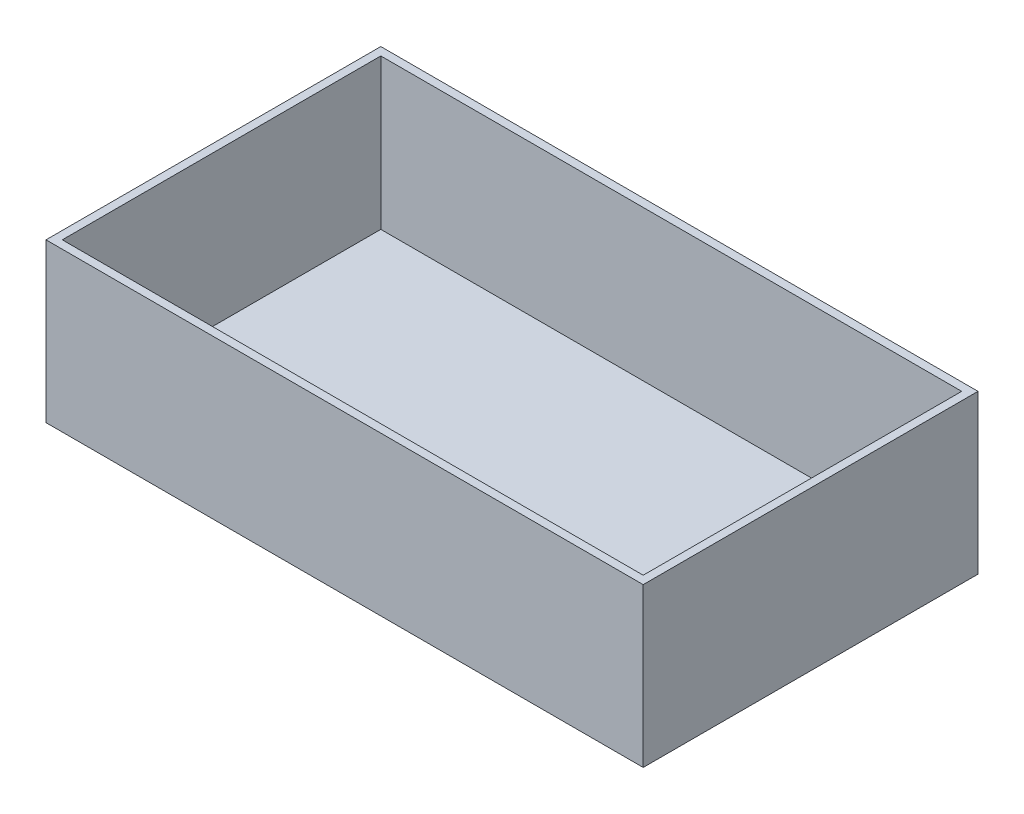
ISO-10303-21;
HEADER;
FILE_DESCRIPTION(('STEP AP214'),'2;1');
FILE_NAME('part.step','',(''),(''),'','','');
FILE_SCHEMA(('AUTOMOTIVE_DESIGN { 1 0 10303 214 1 1 1 1 }'));
ENDSEC;
DATA;
#1=APPLICATION_CONTEXT('core data for automotive mechanical design processes');
#2=APPLICATION_PROTOCOL_DEFINITION('international standard','automotive_design',2000,#1);
#3=PRODUCT_CONTEXT('',#1,'mechanical');
#4=PRODUCT('Part','Part','',(#3));
#5=PRODUCT_RELATED_PRODUCT_CATEGORY('part','',(#4));
#6=PRODUCT_DEFINITION_FORMATION('','',#4);
#7=PRODUCT_DEFINITION_CONTEXT('part definition',#1,'design');
#8=PRODUCT_DEFINITION('design','',#6,#7);
#9=PRODUCT_DEFINITION_SHAPE('','',#8);
#10=(LENGTH_UNIT() NAMED_UNIT(*) SI_UNIT(.MILLI.,.METRE.));
#11=(NAMED_UNIT(*) PLANE_ANGLE_UNIT() SI_UNIT($,.RADIAN.));
#12=(NAMED_UNIT(*) SI_UNIT($,.STERADIAN.) SOLID_ANGLE_UNIT());
#13=UNCERTAINTY_MEASURE_WITH_UNIT(LENGTH_MEASURE(1.E-05),#10,'distance_accuracy_value','');
#14=(GEOMETRIC_REPRESENTATION_CONTEXT(3) GLOBAL_UNCERTAINTY_ASSIGNED_CONTEXT((#13)) GLOBAL_UNIT_ASSIGNED_CONTEXT((#10,
#11,#12)) REPRESENTATION_CONTEXT('',''));
#15=CARTESIAN_POINT('',(0.,0.,0.));
#16=DIRECTION('',(0.,0.,1.));
#17=DIRECTION('',(1.,0.,0.));
#18=AXIS2_PLACEMENT_3D('',#15,#16,#17);
#19=CARTESIAN_POINT('',(660.,350.,370.));
#20=DIRECTION('',(-1.,0.,0.));
#21=DIRECTION('',(0.,0.,1.));
#22=AXIS2_PLACEMENT_3D('',#19,#20,#21);
#23=PLANE('',#22);
#24=DIRECTION('',(0.,0.,-1.));
#25=VECTOR('',#24,1.);
#26=CARTESIAN_POINT('',(660.,0.,370.));
#27=LINE('',#26,#25);
#28=CARTESIAN_POINT('',(660.,0.,370.));
#29=VERTEX_POINT('',#28);
#30=CARTESIAN_POINT('',(660.,0.,-370.));
#31=VERTEX_POINT('',#30);
#32=EDGE_CURVE('E143',#29,#31,#27,.T.);
#33=ORIENTED_EDGE('',*,*,#32,.T.);
#34=DIRECTION('',(0.,-1.,0.));
#35=VECTOR('',#34,1.);
#36=CARTESIAN_POINT('',(660.,350.,-370.));
#37=LINE('',#36,#35);
#38=CARTESIAN_POINT('',(660.,350.,-370.));
#39=VERTEX_POINT('',#38);
#40=EDGE_CURVE('E11',#39,#31,#37,.T.);
#41=ORIENTED_EDGE('',*,*,#40,.F.);
#42=DIRECTION('',(0.,0.,-1.));
#43=VECTOR('',#42,1.);
#44=CARTESIAN_POINT('',(660.,350.,370.));
#45=LINE('',#44,#43);
#46=CARTESIAN_POINT('',(660.,350.,370.));
#47=VERTEX_POINT('',#46);
#48=EDGE_CURVE('E147',#47,#39,#45,.T.);
#49=ORIENTED_EDGE('',*,*,#48,.F.);
#50=DIRECTION('',(0.,-1.,0.));
#51=VECTOR('',#50,1.);
#52=CARTESIAN_POINT('',(660.,350.,370.));
#53=LINE('',#52,#51);
#54=EDGE_CURVE('E153',#47,#29,#53,.T.);
#55=ORIENTED_EDGE('',*,*,#54,.T.);
#56=EDGE_LOOP('',(#33,#41,#49,#55));
#57=FACE_BOUND('',#56,.T.);
#58=ADVANCED_FACE('F35',(#57),#23,.F.);
#59=CARTESIAN_POINT('',(-660.,350.,-370.));
#60=DIRECTION('',(0.,0.,1.));
#61=DIRECTION('',(1.,0.,0.));
#62=AXIS2_PLACEMENT_3D('',#59,#60,#61);
#63=PLANE('',#62);
#64=DIRECTION('',(-1.,0.,0.));
#65=VECTOR('',#64,1.);
#66=CARTESIAN_POINT('',(-660.,0.,-370.));
#67=LINE('',#66,#65);
#68=CARTESIAN_POINT('',(-660.,0.,-370.));
#69=VERTEX_POINT('',#68);
#70=EDGE_CURVE('E156',#31,#69,#67,.T.);
#71=ORIENTED_EDGE('',*,*,#70,.T.);
#72=DIRECTION('',(0.,-1.,0.));
#73=VECTOR('',#72,1.);
#74=CARTESIAN_POINT('',(-660.,350.,-370.));
#75=LINE('',#74,#73);
#76=CARTESIAN_POINT('',(-660.,350.,-370.));
#77=VERTEX_POINT('',#76);
#78=EDGE_CURVE('E42',#77,#69,#75,.T.);
#79=ORIENTED_EDGE('',*,*,#78,.F.);
#80=DIRECTION('',(-1.,0.,0.));
#81=VECTOR('',#80,1.);
#82=CARTESIAN_POINT('',(-660.,350.,-370.));
#83=LINE('',#82,#81);
#84=EDGE_CURVE('E86',#39,#77,#83,.T.);
#85=ORIENTED_EDGE('',*,*,#84,.F.);
#86=ORIENTED_EDGE('',*,*,#40,.T.);
#87=EDGE_LOOP('',(#71,#79,#85,#86));
#88=FACE_BOUND('',#87,.T.);
#89=ADVANCED_FACE('F185',(#88),#63,.F.);
#90=CARTESIAN_POINT('',(-660.,350.,370.));
#91=DIRECTION('',(1.,0.,0.));
#92=DIRECTION('',(0.,0.,-1.));
#93=AXIS2_PLACEMENT_3D('',#90,#91,#92);
#94=PLANE('',#93);
#95=DIRECTION('',(0.,0.,1.));
#96=VECTOR('',#95,1.);
#97=CARTESIAN_POINT('',(-660.,0.,370.));
#98=LINE('',#97,#96);
#99=CARTESIAN_POINT('',(-660.,0.,370.));
#100=VERTEX_POINT('',#99);
#101=EDGE_CURVE('E158',#69,#100,#98,.T.);
#102=ORIENTED_EDGE('',*,*,#101,.T.);
#103=DIRECTION('',(0.,-1.,0.));
#104=VECTOR('',#103,1.);
#105=CARTESIAN_POINT('',(-660.,350.,370.));
#106=LINE('',#105,#104);
#107=CARTESIAN_POINT('',(-660.,350.,370.));
#108=VERTEX_POINT('',#107);
#109=EDGE_CURVE('E162',#108,#100,#106,.T.);
#110=ORIENTED_EDGE('',*,*,#109,.F.);
#111=DIRECTION('',(0.,0.,1.));
#112=VECTOR('',#111,1.);
#113=CARTESIAN_POINT('',(-660.,350.,370.));
#114=LINE('',#113,#112);
#115=EDGE_CURVE('E150',#77,#108,#114,.T.);
#116=ORIENTED_EDGE('',*,*,#115,.F.);
#117=ORIENTED_EDGE('',*,*,#78,.T.);
#118=EDGE_LOOP('',(#102,#110,#116,#117));
#119=FACE_BOUND('',#118,.T.);
#120=ADVANCED_FACE('F167',(#119),#94,.F.);
#121=CARTESIAN_POINT('',(-660.,350.,370.));
#122=DIRECTION('',(0.,0.,-1.));
#123=DIRECTION('',(-1.,0.,0.));
#124=AXIS2_PLACEMENT_3D('',#121,#122,#123);
#125=PLANE('',#124);
#126=DIRECTION('',(1.,0.,0.));
#127=VECTOR('',#126,1.);
#128=CARTESIAN_POINT('',(-660.,0.,370.));
#129=LINE('',#128,#127);
#130=EDGE_CURVE('E79',#100,#29,#129,.T.);
#131=ORIENTED_EDGE('',*,*,#130,.T.);
#132=ORIENTED_EDGE('',*,*,#54,.F.);
#133=DIRECTION('',(1.,0.,0.));
#134=VECTOR('',#133,1.);
#135=CARTESIAN_POINT('',(-660.,350.,370.));
#136=LINE('',#135,#134);
#137=EDGE_CURVE('E58',#108,#47,#136,.T.);
#138=ORIENTED_EDGE('',*,*,#137,.F.);
#139=ORIENTED_EDGE('',*,*,#109,.T.);
#140=EDGE_LOOP('',(#131,#132,#138,#139));
#141=FACE_BOUND('',#140,.T.);
#142=ADVANCED_FACE('F175',(#141),#125,.F.);
#143=CARTESIAN_POINT('',(0.,350.,0.));
#144=DIRECTION('',(0.,-1.,0.));
#145=DIRECTION('',(0.,0.,-1.));
#146=AXIS2_PLACEMENT_3D('',#143,#144,#145);
#147=PLANE('',#146);
#148=DIRECTION('',(-1.,0.,0.));
#149=VECTOR('',#148,1.);
#150=CARTESIAN_POINT('',(-642.,350.,-352.));
#151=LINE('',#150,#149);
#152=CARTESIAN_POINT('',(642.,350.,-352.));
#153=VERTEX_POINT('',#152);
#154=CARTESIAN_POINT('',(-642.,350.,-352.));
#155=VERTEX_POINT('',#154);
#156=EDGE_CURVE('E137',#153,#155,#151,.T.);
#157=ORIENTED_EDGE('',*,*,#156,.F.);
#158=DIRECTION('',(0.,0.,-1.));
#159=VECTOR('',#158,1.);
#160=CARTESIAN_POINT('',(642.,350.,352.));
#161=LINE('',#160,#159);
#162=CARTESIAN_POINT('',(642.,350.,352.));
#163=VERTEX_POINT('',#162);
#164=EDGE_CURVE('E49',#163,#153,#161,.T.);
#165=ORIENTED_EDGE('',*,*,#164,.F.);
#166=DIRECTION('',(1.,0.,0.));
#167=VECTOR('',#166,1.);
#168=CARTESIAN_POINT('',(-642.,350.,352.));
#169=LINE('',#168,#167);
#170=CARTESIAN_POINT('',(-642.,350.,352.));
#171=VERTEX_POINT('',#170);
#172=EDGE_CURVE('E128',#171,#163,#169,.T.);
#173=ORIENTED_EDGE('',*,*,#172,.F.);
#174=DIRECTION('',(0.,0.,1.));
#175=VECTOR('',#174,1.);
#176=CARTESIAN_POINT('',(-642.,350.,352.));
#177=LINE('',#176,#175);
#178=EDGE_CURVE('E131',#155,#171,#177,.T.);
#179=ORIENTED_EDGE('',*,*,#178,.F.);
#180=EDGE_LOOP('',(#157,#165,#173,#179));
#181=FACE_BOUND('',#180,.T.);
#182=ORIENTED_EDGE('',*,*,#48,.T.);
#183=ORIENTED_EDGE('',*,*,#84,.T.);
#184=ORIENTED_EDGE('',*,*,#115,.T.);
#185=ORIENTED_EDGE('',*,*,#137,.T.);
#186=EDGE_LOOP('',(#182,#183,#184,#185));
#187=FACE_BOUND('',#186,.T.);
#188=ADVANCED_FACE('F177',(#181,#187),#147,.F.);
#189=CARTESIAN_POINT('',(0.,0.,0.));
#190=DIRECTION('',(0.,-1.,0.));
#191=DIRECTION('',(0.,0.,-1.));
#192=AXIS2_PLACEMENT_3D('',#189,#190,#191);
#193=PLANE('',#192);
#194=ORIENTED_EDGE('',*,*,#32,.F.);
#195=ORIENTED_EDGE('',*,*,#130,.F.);
#196=ORIENTED_EDGE('',*,*,#101,.F.);
#197=ORIENTED_EDGE('',*,*,#70,.F.);
#198=EDGE_LOOP('',(#194,#195,#196,#197));
#199=FACE_BOUND('',#198,.T.);
#200=ADVANCED_FACE('F171',(#199),#193,.T.);
#201=CARTESIAN_POINT('',(642.,18.,352.));
#202=DIRECTION('',(1.,0.,0.));
#203=DIRECTION('',(0.,0.,-1.));
#204=AXIS2_PLACEMENT_3D('',#201,#202,#203);
#205=PLANE('',#204);
#206=ORIENTED_EDGE('',*,*,#164,.T.);
#207=DIRECTION('',(0.,1.,0.));
#208=VECTOR('',#207,1.);
#209=CARTESIAN_POINT('',(642.,18.,-352.));
#210=LINE('',#209,#208);
#211=CARTESIAN_POINT('',(642.,18.,-352.));
#212=VERTEX_POINT('',#211);
#213=EDGE_CURVE('E106',#212,#153,#210,.T.);
#214=ORIENTED_EDGE('',*,*,#213,.F.);
#215=DIRECTION('',(0.,0.,-1.));
#216=VECTOR('',#215,1.);
#217=CARTESIAN_POINT('',(642.,18.,352.));
#218=LINE('',#217,#216);
#219=CARTESIAN_POINT('',(642.,18.,352.));
#220=VERTEX_POINT('',#219);
#221=EDGE_CURVE('E110',#220,#212,#218,.T.);
#222=ORIENTED_EDGE('',*,*,#221,.F.);
#223=DIRECTION('',(0.,1.,0.));
#224=VECTOR('',#223,1.);
#225=CARTESIAN_POINT('',(642.,18.,352.));
#226=LINE('',#225,#224);
#227=EDGE_CURVE('E141',#220,#163,#226,.T.);
#228=ORIENTED_EDGE('',*,*,#227,.T.);
#229=EDGE_LOOP('',(#206,#214,#222,#228));
#230=FACE_BOUND('',#229,.T.);
#231=ADVANCED_FACE('F108',(#230),#205,.F.);
#232=CARTESIAN_POINT('',(-642.,18.,352.));
#233=DIRECTION('',(0.,0.,1.));
#234=DIRECTION('',(1.,0.,0.));
#235=AXIS2_PLACEMENT_3D('',#232,#233,#234);
#236=PLANE('',#235);
#237=ORIENTED_EDGE('',*,*,#172,.T.);
#238=ORIENTED_EDGE('',*,*,#227,.F.);
#239=DIRECTION('',(1.,0.,0.));
#240=VECTOR('',#239,1.);
#241=CARTESIAN_POINT('',(-642.,18.,352.));
#242=LINE('',#241,#240);
#243=CARTESIAN_POINT('',(-642.,18.,352.));
#244=VERTEX_POINT('',#243);
#245=EDGE_CURVE('E116',#244,#220,#242,.T.);
#246=ORIENTED_EDGE('',*,*,#245,.F.);
#247=DIRECTION('',(0.,1.,0.));
#248=VECTOR('',#247,1.);
#249=CARTESIAN_POINT('',(-642.,18.,352.));
#250=LINE('',#249,#248);
#251=EDGE_CURVE('E144',#244,#171,#250,.T.);
#252=ORIENTED_EDGE('',*,*,#251,.T.);
#253=EDGE_LOOP('',(#237,#238,#246,#252));
#254=FACE_BOUND('',#253,.T.);
#255=ADVANCED_FACE('F224',(#254),#236,.F.);
#256=CARTESIAN_POINT('',(-642.,18.,352.));
#257=DIRECTION('',(-1.,0.,0.));
#258=DIRECTION('',(0.,0.,1.));
#259=AXIS2_PLACEMENT_3D('',#256,#257,#258);
#260=PLANE('',#259);
#261=ORIENTED_EDGE('',*,*,#178,.T.);
#262=ORIENTED_EDGE('',*,*,#251,.F.);
#263=DIRECTION('',(0.,0.,1.));
#264=VECTOR('',#263,1.);
#265=CARTESIAN_POINT('',(-642.,18.,352.));
#266=LINE('',#265,#264);
#267=CARTESIAN_POINT('',(-642.,18.,-352.));
#268=VERTEX_POINT('',#267);
#269=EDGE_CURVE('E124',#268,#244,#266,.T.);
#270=ORIENTED_EDGE('',*,*,#269,.F.);
#271=DIRECTION('',(0.,1.,0.));
#272=VECTOR('',#271,1.);
#273=CARTESIAN_POINT('',(-642.,18.,-352.));
#274=LINE('',#273,#272);
#275=EDGE_CURVE('E115',#268,#155,#274,.T.);
#276=ORIENTED_EDGE('',*,*,#275,.T.);
#277=EDGE_LOOP('',(#261,#262,#270,#276));
#278=FACE_BOUND('',#277,.T.);
#279=ADVANCED_FACE('F233',(#278),#260,.F.);
#280=CARTESIAN_POINT('',(-642.,18.,-352.));
#281=DIRECTION('',(0.,0.,-1.));
#282=DIRECTION('',(-1.,0.,0.));
#283=AXIS2_PLACEMENT_3D('',#280,#281,#282);
#284=PLANE('',#283);
#285=ORIENTED_EDGE('',*,*,#156,.T.);
#286=ORIENTED_EDGE('',*,*,#275,.F.);
#287=DIRECTION('',(-1.,0.,0.));
#288=VECTOR('',#287,1.);
#289=CARTESIAN_POINT('',(-642.,18.,-352.));
#290=LINE('',#289,#288);
#291=EDGE_CURVE('E119',#212,#268,#290,.T.);
#292=ORIENTED_EDGE('',*,*,#291,.F.);
#293=ORIENTED_EDGE('',*,*,#213,.T.);
#294=EDGE_LOOP('',(#285,#286,#292,#293));
#295=FACE_BOUND('',#294,.T.);
#296=ADVANCED_FACE('F120',(#295),#284,.F.);
#297=CARTESIAN_POINT('',(0.,18.,0.));
#298=DIRECTION('',(0.,-1.,0.));
#299=DIRECTION('',(0.,0.,-1.));
#300=AXIS2_PLACEMENT_3D('',#297,#298,#299);
#301=PLANE('',#300);
#302=ORIENTED_EDGE('',*,*,#221,.T.);
#303=ORIENTED_EDGE('',*,*,#291,.T.);
#304=ORIENTED_EDGE('',*,*,#269,.T.);
#305=ORIENTED_EDGE('',*,*,#245,.T.);
#306=EDGE_LOOP('',(#302,#303,#304,#305));
#307=FACE_BOUND('',#306,.T.);
#308=ADVANCED_FACE('F126',(#307),#301,.F.);
#309=CLOSED_SHELL('',(#58,#89,#120,#142,#188,#200,#231,#255,#279,#296,#308));
#310=MANIFOLD_SOLID_BREP('B2',#309);
#311=ADVANCED_BREP_SHAPE_REPRESENTATION('',(#18,#310),#14);
#312=SHAPE_DEFINITION_REPRESENTATION(#9,#311);
ENDSEC;
END-ISO-10303-21;
